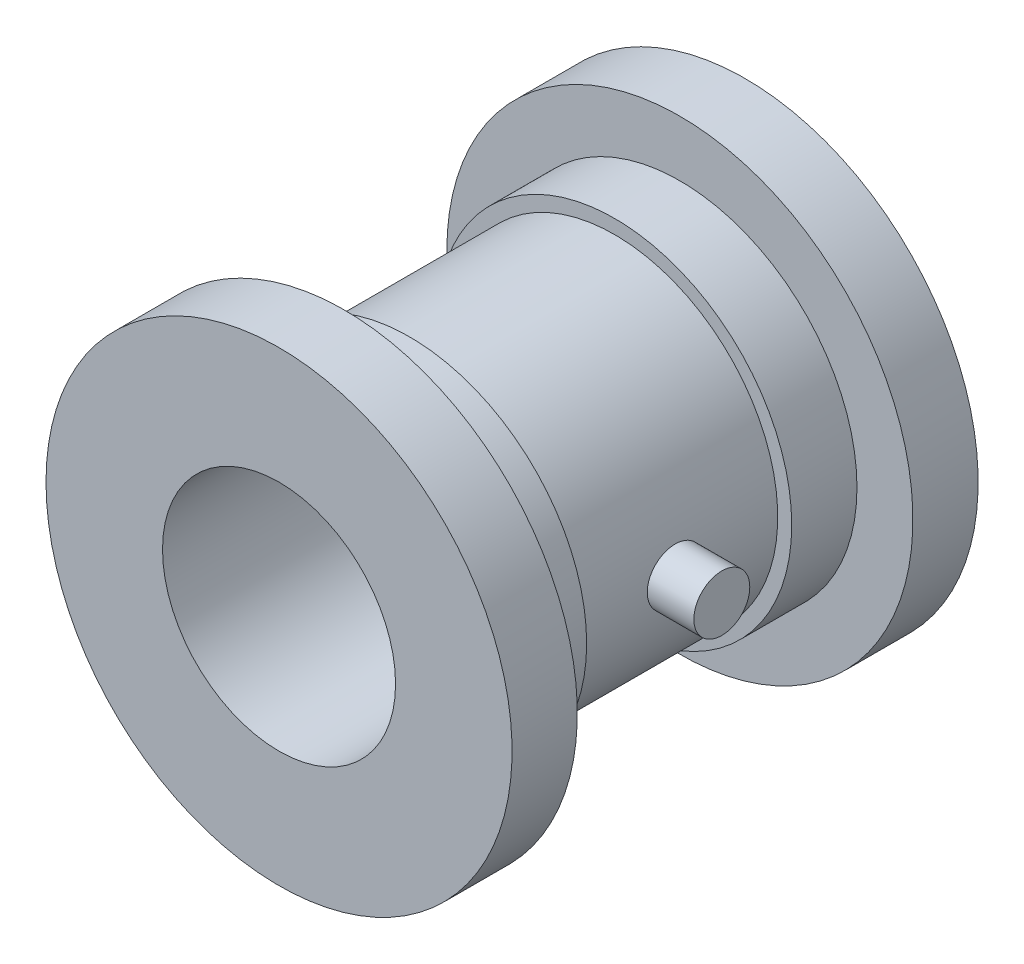
ISO-10303-21;
HEADER;
FILE_DESCRIPTION(('STEP AP214'),'2;1');
FILE_NAME('part.step','',(''),(''),'','','');
FILE_SCHEMA(('AUTOMOTIVE_DESIGN { 1 0 10303 214 1 1 1 1 }'));
ENDSEC;
DATA;
#1=APPLICATION_CONTEXT('core data for automotive mechanical design processes');
#2=APPLICATION_PROTOCOL_DEFINITION('international standard','automotive_design',2000,#1);
#3=PRODUCT_CONTEXT('',#1,'mechanical');
#4=PRODUCT('Part','Part','',(#3));
#5=PRODUCT_RELATED_PRODUCT_CATEGORY('part','',(#4));
#6=PRODUCT_DEFINITION_FORMATION('','',#4);
#7=PRODUCT_DEFINITION_CONTEXT('part definition',#1,'design');
#8=PRODUCT_DEFINITION('design','',#6,#7);
#9=PRODUCT_DEFINITION_SHAPE('','',#8);
#10=(LENGTH_UNIT() NAMED_UNIT(*) SI_UNIT(.MILLI.,.METRE.));
#11=(NAMED_UNIT(*) PLANE_ANGLE_UNIT() SI_UNIT($,.RADIAN.));
#12=(NAMED_UNIT(*) SI_UNIT($,.STERADIAN.) SOLID_ANGLE_UNIT());
#13=UNCERTAINTY_MEASURE_WITH_UNIT(LENGTH_MEASURE(1.E-05),#10,'distance_accuracy_value','');
#14=(GEOMETRIC_REPRESENTATION_CONTEXT(3) GLOBAL_UNCERTAINTY_ASSIGNED_CONTEXT((#13)) GLOBAL_UNIT_ASSIGNED_CONTEXT((#10,
#11,#12)) REPRESENTATION_CONTEXT('',''));
#15=CARTESIAN_POINT('',(0.,0.,0.));
#16=DIRECTION('',(0.,0.,1.));
#17=DIRECTION('',(1.,0.,0.));
#18=AXIS2_PLACEMENT_3D('',#15,#16,#17);
#19=CARTESIAN_POINT('',(22.5,0.,0.));
#20=DIRECTION('',(-1.,0.,0.));
#21=DIRECTION('',(0.,0.,1.));
#22=AXIS2_PLACEMENT_3D('',#19,#20,#21);
#23=CYLINDRICAL_SURFACE('',#22,3.);
#24=CARTESIAN_POINT('',(22.5,0.,0.));
#25=DIRECTION('',(1.,0.,0.));
#26=DIRECTION('',(0.,0.,-1.));
#27=AXIS2_PLACEMENT_3D('',#24,#25,#26);
#28=CIRCLE('',#27,3.);
#29=CARTESIAN_POINT('',(22.5,0.,-3.));
#30=VERTEX_POINT('',#29);
#31=EDGE_CURVE('E11',#30,#30,#28,.T.);
#32=ORIENTED_EDGE('',*,*,#31,.F.);
#33=EDGE_LOOP('',(#32));
#34=FACE_BOUND('',#33,.T.);
#35=CARTESIAN_POINT('',(17.5,0.,0.));
#36=DIRECTION('',(1.,0.,0.));
#37=DIRECTION('',(0.,0.,-1.));
#38=AXIS2_PLACEMENT_3D('',#35,#36,#37);
#39=CIRCLE('',#38,3.);
#40=CARTESIAN_POINT('',(17.5,0.,-3.));
#41=VERTEX_POINT('',#40);
#42=EDGE_CURVE('E41',#41,#41,#39,.T.);
#43=ORIENTED_EDGE('',*,*,#42,.T.);
#44=EDGE_LOOP('',(#43));
#45=FACE_BOUND('',#44,.T.);
#46=ADVANCED_FACE('F38',(#34,#45),#23,.T.);
#47=CARTESIAN_POINT('',(22.5,0.,0.));
#48=DIRECTION('',(1.,0.,0.));
#49=DIRECTION('',(0.,0.,-1.));
#50=AXIS2_PLACEMENT_3D('',#47,#48,#49);
#51=PLANE('',#50);
#52=ORIENTED_EDGE('',*,*,#31,.T.);
#53=EDGE_LOOP('',(#52));
#54=FACE_BOUND('',#53,.T.);
#55=ADVANCED_FACE('F53',(#54),#51,.T.);
#56=CARTESIAN_POINT('',(17.5,0.,0.));
#57=DIRECTION('',(1.,0.,0.));
#58=DIRECTION('',(0.,0.,-1.));
#59=AXIS2_PLACEMENT_3D('',#56,#57,#58);
#60=PLANE('',#59);
#61=ORIENTED_EDGE('',*,*,#42,.F.);
#62=EDGE_LOOP('',(#61));
#63=FACE_BOUND('',#62,.T.);
#64=ADVANCED_FACE('F51',(#63),#60,.F.);
#65=CLOSED_SHELL('',(#46,#55,#64));
#66=MANIFOLD_SOLID_BREP('B2',#65);
#67=CARTESIAN_POINT('',(0.,0.,-158.679414735268));
#68=DIRECTION('',(0.,0.,-1.));
#69=DIRECTION('',(-1.,0.,0.));
#70=AXIS2_PLACEMENT_3D('',#67,#68,#69);
#71=CYLINDRICAL_SURFACE('',#70,25.);
#72=CARTESIAN_POINT('',(0.,0.,-18.));
#73=DIRECTION('',(0.,0.,-1.));
#74=DIRECTION('',(-1.,0.,0.));
#75=AXIS2_PLACEMENT_3D('',#72,#73,#74);
#76=CIRCLE('',#75,25.);
#77=CARTESIAN_POINT('',(-25.,0.,-18.));
#78=VERTEX_POINT('',#77);
#79=EDGE_CURVE('E37',#78,#78,#76,.T.);
#80=ORIENTED_EDGE('',*,*,#79,.T.);
#81=EDGE_LOOP('',(#80));
#82=FACE_BOUND('',#81,.T.);
#83=CARTESIAN_POINT('',(0.,0.,-25.));
#84=DIRECTION('',(0.,0.,-1.));
#85=DIRECTION('',(-1.,0.,0.));
#86=AXIS2_PLACEMENT_3D('',#83,#84,#85);
#87=CIRCLE('',#86,25.);
#88=CARTESIAN_POINT('',(-25.,0.,-25.));
#89=VERTEX_POINT('',#88);
#90=EDGE_CURVE('E122',#89,#89,#87,.T.);
#91=ORIENTED_EDGE('',*,*,#90,.F.);
#92=EDGE_LOOP('',(#91));
#93=FACE_BOUND('',#92,.T.);
#94=ADVANCED_FACE('F78',(#82,#93),#71,.T.);
#95=CARTESIAN_POINT('',(0.,25.,-18.));
#96=DIRECTION('',(0.,0.,1.));
#97=DIRECTION('',(1.,0.,0.));
#98=AXIS2_PLACEMENT_3D('',#95,#96,#97);
#99=PLANE('',#98);
#100=CARTESIAN_POINT('',(0.,0.,-18.));
#101=DIRECTION('',(0.,0.,-1.));
#102=DIRECTION('',(-1.,0.,0.));
#103=AXIS2_PLACEMENT_3D('',#100,#101,#102);
#104=CIRCLE('',#103,19.);
#105=CARTESIAN_POINT('',(-19.,0.,-18.));
#106=VERTEX_POINT('',#105);
#107=EDGE_CURVE('E89',#106,#106,#104,.T.);
#108=ORIENTED_EDGE('',*,*,#107,.T.);
#109=EDGE_LOOP('',(#108));
#110=FACE_BOUND('',#109,.T.);
#111=ORIENTED_EDGE('',*,*,#79,.F.);
#112=EDGE_LOOP('',(#111));
#113=FACE_BOUND('',#112,.T.);
#114=ADVANCED_FACE('F173',(#110,#113),#99,.T.);
#115=CARTESIAN_POINT('',(0.,0.,-158.679414735268));
#116=DIRECTION('',(0.,0.,-1.));
#117=DIRECTION('',(-1.,0.,0.));
#118=AXIS2_PLACEMENT_3D('',#115,#116,#117);
#119=CYLINDRICAL_SURFACE('',#118,19.);
#120=CARTESIAN_POINT('',(0.,0.,-11.));
#121=DIRECTION('',(0.,0.,-1.));
#122=DIRECTION('',(-1.,0.,0.));
#123=AXIS2_PLACEMENT_3D('',#120,#121,#122);
#124=CIRCLE('',#123,19.);
#125=CARTESIAN_POINT('',(-19.,0.,-11.));
#126=VERTEX_POINT('',#125);
#127=EDGE_CURVE('E93',#126,#126,#124,.T.);
#128=ORIENTED_EDGE('',*,*,#127,.T.);
#129=EDGE_LOOP('',(#128));
#130=FACE_BOUND('',#129,.T.);
#131=ORIENTED_EDGE('',*,*,#107,.F.);
#132=EDGE_LOOP('',(#131));
#133=FACE_BOUND('',#132,.T.);
#134=ADVANCED_FACE('F177',(#130,#133),#119,.T.);
#135=CARTESIAN_POINT('',(0.,19.,-11.));
#136=DIRECTION('',(0.,0.,1.));
#137=DIRECTION('',(1.,0.,0.));
#138=AXIS2_PLACEMENT_3D('',#135,#136,#137);
#139=PLANE('',#138);
#140=CARTESIAN_POINT('',(0.,0.,-11.));
#141=DIRECTION('',(0.,0.,-1.));
#142=DIRECTION('',(-1.,0.,0.));
#143=AXIS2_PLACEMENT_3D('',#140,#141,#142);
#144=CIRCLE('',#143,17.5);
#145=CARTESIAN_POINT('',(-17.5,0.,-11.));
#146=VERTEX_POINT('',#145);
#147=EDGE_CURVE('E98',#146,#146,#144,.T.);
#148=ORIENTED_EDGE('',*,*,#147,.T.);
#149=EDGE_LOOP('',(#148));
#150=FACE_BOUND('',#149,.T.);
#151=ORIENTED_EDGE('',*,*,#127,.F.);
#152=EDGE_LOOP('',(#151));
#153=FACE_BOUND('',#152,.T.);
#154=ADVANCED_FACE('F169',(#150,#153),#139,.T.);
#155=CARTESIAN_POINT('',(0.,0.,-158.679414735268));
#156=DIRECTION('',(0.,0.,-1.));
#157=DIRECTION('',(-1.,0.,0.));
#158=AXIS2_PLACEMENT_3D('',#155,#156,#157);
#159=CYLINDRICAL_SURFACE('',#158,17.5);
#160=CARTESIAN_POINT('',(-17.5,0.,2.));
#161=CARTESIAN_POINT('',(-17.4999985510682,0.111949281131271,1.99999519972221));
#162=CARTESIAN_POINT('',(-17.4989143966958,0.223970370284168,1.9905688469133));
#163=CARTESIAN_POINT('',(-17.4946937577693,0.444900622583234,1.95311111433452));
#164=CARTESIAN_POINT('',(-17.4915550764498,0.553806324423903,1.92505981972606));
#165=CARTESIAN_POINT('',(-17.4835792974507,0.765274995712128,1.85118493954277));
#166=CARTESIAN_POINT('',(-17.4787432899077,0.867841986694445,1.80537275922766));
#167=CARTESIAN_POINT('',(-17.4679120331755,1.06381060236176,1.69730025928979));
#168=CARTESIAN_POINT('',(-17.4619169972561,1.15721390847253,1.63504296491735));
#169=CARTESIAN_POINT('',(-17.4494069384049,1.33265783514777,1.49553827629261));
#170=CARTESIAN_POINT('',(-17.4428898679339,1.41464987662083,1.41822996562049));
#171=CARTESIAN_POINT('',(-17.4300869526196,1.56452579579969,1.25094824366483));
#172=CARTESIAN_POINT('',(-17.4238011190613,1.63240898570475,1.16097421529119));
#173=CARTESIAN_POINT('',(-17.4121519566138,1.75231750467917,0.97060423254096));
#174=CARTESIAN_POINT('',(-17.4067912557056,1.80429797266076,0.870179846835984));
#175=CARTESIAN_POINT('',(-17.3976257108765,1.89063905410776,0.661956037568454));
#176=CARTESIAN_POINT('',(-17.3938208173886,1.92500022892039,0.554156849089708));
#177=CARTESIAN_POINT('',(-17.3882168566911,1.97498120601605,0.334744186795484));
#178=CARTESIAN_POINT('',(-17.3864090748178,1.99068245631194,0.223149492773667));
#179=CARTESIAN_POINT('',(-17.3849772070577,2.00314979639016,-0.00110459341705646));
#180=CARTESIAN_POINT('',(-17.3853530472536,1.99991652712141,-0.1137639494174));
#181=CARTESIAN_POINT('',(-17.3882379876878,1.9746735877826,-0.336384576951136));
#182=CARTESIAN_POINT('',(-17.3907369355841,1.95275327430006,-0.446356130792127));
#183=CARTESIAN_POINT('',(-17.3975706833085,1.89089772862114,-0.661049381098405));
#184=CARTESIAN_POINT('',(-17.4019055147219,1.85096218648165,-0.765770987206492));
#185=CARTESIAN_POINT('',(-17.4119342022004,1.75411258690629,-0.967271409063269));
#186=CARTESIAN_POINT('',(-17.4176311898807,1.697159329054,-1.0640312212313));
#187=CARTESIAN_POINT('',(-17.4297397716759,1.5679190891396,-1.24665329274372));
#188=CARTESIAN_POINT('',(-17.4361513931222,1.49563152051157,-1.33251513501963));
#189=CARTESIAN_POINT('',(-17.4490120091816,1.33727766100704,-1.49142289169273));
#190=CARTESIAN_POINT('',(-17.455461005996,1.25113428048549,-1.56439200697674));
#191=CARTESIAN_POINT('',(-17.4676349914203,1.06778054344645,-1.69484625362185));
#192=CARTESIAN_POINT('',(-17.4733599787928,0.970570168013122,-1.75233135851693));
#193=CARTESIAN_POINT('',(-17.4834436495983,0.767785399909199,-1.85018441798749));
#194=CARTESIAN_POINT('',(-17.487801982302,0.662208868897606,-1.89054797953882));
#195=CARTESIAN_POINT('',(-17.4946579437091,0.445716005555924,-1.95295335032392));
#196=CARTESIAN_POINT('',(-17.4971556451608,0.33479988217787,-1.97499587589154));
#197=CARTESIAN_POINT('',(-17.4999995196358,0.111440847189143,-2.00003489194185));
#198=CARTESIAN_POINT('',(-17.5003576527763,-0.000990049263884221,-2.00313725942906));
#199=CARTESIAN_POINT('',(-17.4989142301576,-0.224770143214528,-1.99048670077362));
#200=CARTESIAN_POINT('',(-17.4971127126976,-0.336119359859263,-1.97473410900327));
#201=CARTESIAN_POINT('',(-17.4915599395696,-0.554265994438542,-1.9249086964044));
#202=CARTESIAN_POINT('',(-17.4878140135584,-0.661074995715398,-1.89088594563397));
#203=CARTESIAN_POINT('',(-17.4787921749894,-0.86747060654654,-1.80553777762337));
#204=CARTESIAN_POINT('',(-17.4735162183709,-0.967057008006426,-1.75421186209241));
#205=CARTESIAN_POINT('',(-17.4619935546906,-1.1566560556988,-1.63545523933527));
#206=CARTESIAN_POINT('',(-17.4557427309721,-1.24662524248109,-1.56795555368873));
#207=CARTESIAN_POINT('',(-17.4429836190554,-1.41399482686995,-1.41886564059422));
#208=CARTESIAN_POINT('',(-17.4364753223705,-1.49139480973755,-1.33727494837641));
#209=CARTESIAN_POINT('',(-17.4238982965486,-1.63180089287333,-1.16185467559832));
#210=CARTESIAN_POINT('',(-17.4178317940395,-1.69473712215655,-1.06796898786935));
#211=CARTESIAN_POINT('',(-17.4068606742744,-1.80394755942105,-0.87089807794968));
#212=CARTESIAN_POINT('',(-17.4019560370195,-1.85022205420212,-0.767713015868109));
#213=CARTESIAN_POINT('',(-17.3938786287494,-1.92468057699606,-0.555204287235232));
#214=CARTESIAN_POINT('',(-17.3907019940762,-1.9529049884149,-0.445894923210457));
#215=CARTESIAN_POINT('',(-17.3864287991637,-1.99059267414119,-0.224049989074731));
#216=CARTESIAN_POINT('',(-17.385332159207,-2.00005666745658,-0.111514542773653));
#217=CARTESIAN_POINT('',(-17.385345163739,-1.99994314687055,0.112893307638868));
#218=CARTESIAN_POINT('',(-17.3864420908835,-1.99047539100516,0.224765784023058));
#219=CARTESIAN_POINT('',(-17.3906913968281,-1.95299850876729,0.445318988088051));
#220=CARTESIAN_POINT('',(-17.3938437768924,-1.92498937098975,0.553999713805521));
#221=CARTESIAN_POINT('',(-17.4018450488478,-1.85125733006852,0.765076043362251));
#222=CARTESIAN_POINT('',(-17.4066935227579,-1.80553879088569,0.867473188409541));
#223=CARTESIAN_POINT('',(-17.4175414489812,-1.69769666392679,1.06315918160624));
#224=CARTESIAN_POINT('',(-17.4235409062907,-1.63557300493567,1.15644799021371));
#225=CARTESIAN_POINT('',(-17.4360565183282,-1.496274276119,1.33183113362611));
#226=CARTESIAN_POINT('',(-17.4425753637158,-1.41901733601474,1.41386025390555));
#227=CARTESIAN_POINT('',(-17.4553710614581,-1.25181311513089,1.56383427394015));
#228=CARTESIAN_POINT('',(-17.4616478560018,-1.16186282631113,1.63177582580489));
#229=CARTESIAN_POINT('',(-17.4732739611811,-0.971500170550116,1.75182617233102));
#230=CARTESIAN_POINT('',(-17.4786202345149,-0.871055194164788,1.80388352106762));
#231=CARTESIAN_POINT('',(-17.4877513427388,-0.662847939396797,1.8903202121152));
#232=CARTESIAN_POINT('',(-17.4915379025678,-0.555093898848711,1.92471909393972));
#233=CARTESIAN_POINT('',(-17.4961924479184,-0.372298085692646,1.96647110226512));
#234=CARTESIAN_POINT('',(-17.4976134605341,-0.298416630910324,1.97902677875614));
#235=CARTESIAN_POINT('',(-17.499517718344,-0.149700818660187,1.99579280851968));
#236=CARTESIAN_POINT('',(-17.5000009689781,-0.074866466722564,2.00000321020228));
#237=CARTESIAN_POINT('',(-17.5,0.,2.));
#238=B_SPLINE_CURVE_WITH_KNOTS('',3,(#160,#161,#162,#163,#164,#165,#166,#167,#168,#169,#170,
#171,#172,#173,#174,#175,#176,#177,#178,#179,#180,#181,#182,#183,#184,#185,#186,#187,#188,#189,
#190,#191,#192,#193,#194,#195,#196,#197,#198,#199,#200,#201,#202,#203,#204,#205,#206,#207,#208,
#209,#210,#211,#212,#213,#214,#215,#216,#217,#218,#219,#220,#221,#222,#223,#224,#225,#226,#227,
#228,#229,#230,#231,#232,#233,#234,#235,#236,#237),.UNSPECIFIED.,.T.,.F.,(4,2,2,2,2,2,2,2,2,2,2,
2,2,2,2,2,2,2,2,2,2,2,2,2,2,2,2,2,2,2,2,2,2,2,2,2,2,2,4),(0.,0.33557441666428,0.671508227518322,
1.00722667281621,1.34288340216198,1.67992799894876,2.01698902267013,2.3549922992977,
2.69298480653802,3.02949654002249,3.36599688237659,3.70089713523239,4.03580315010126,
4.3714866496878,4.7071829921089,5.04481612297898,5.38244983094421,5.72017011621975,
6.05787719635448,6.39369472529332,6.72950629895979,7.06440223033913,7.3993078067643,
7.73566795085562,8.07203919137998,8.41000271890796,8.74796042876379,9.08515935679785,
9.42234536116483,9.75758217571838,10.0928191964808,10.4279736604432,10.763129579344,
11.100151413458,11.4372532487619,11.7754355791756,12.1132428917892,12.3376607387197,
12.5620772838218),.UNSPECIFIED.);
#239=CARTESIAN_POINT('',(-17.5,0.,2.));
#240=VERTEX_POINT('',#239);
#241=EDGE_CURVE('E125',#240,#240,#238,.T.);
#242=ORIENTED_EDGE('',*,*,#241,.F.);
#243=EDGE_LOOP('',(#242));
#244=FACE_BOUND('',#243,.T.);
#245=CARTESIAN_POINT('',(0.,0.,11.));
#246=DIRECTION('',(0.,0.,-1.));
#247=DIRECTION('',(-1.,0.,0.));
#248=AXIS2_PLACEMENT_3D('',#245,#246,#247);
#249=CIRCLE('',#248,17.5);
#250=CARTESIAN_POINT('',(-17.5,0.,11.));
#251=VERTEX_POINT('',#250);
#252=EDGE_CURVE('E101',#251,#251,#249,.T.);
#253=ORIENTED_EDGE('',*,*,#252,.T.);
#254=EDGE_LOOP('',(#253));
#255=FACE_BOUND('',#254,.T.);
#256=ORIENTED_EDGE('',*,*,#147,.F.);
#257=EDGE_LOOP('',(#256));
#258=FACE_BOUND('',#257,.T.);
#259=ADVANCED_FACE('F130',(#244,#255,#258),#159,.T.);
#260=CARTESIAN_POINT('',(0.,19.,11.));
#261=DIRECTION('',(0.,0.,-1.));
#262=DIRECTION('',(-1.,0.,0.));
#263=AXIS2_PLACEMENT_3D('',#260,#261,#262);
#264=PLANE('',#263);
#265=CARTESIAN_POINT('',(0.,0.,11.));
#266=DIRECTION('',(0.,0.,-1.));
#267=DIRECTION('',(-1.,0.,0.));
#268=AXIS2_PLACEMENT_3D('',#265,#266,#267);
#269=CIRCLE('',#268,19.);
#270=CARTESIAN_POINT('',(-19.,0.,11.));
#271=VERTEX_POINT('',#270);
#272=EDGE_CURVE('E104',#271,#271,#269,.T.);
#273=ORIENTED_EDGE('',*,*,#272,.T.);
#274=EDGE_LOOP('',(#273));
#275=FACE_BOUND('',#274,.T.);
#276=ORIENTED_EDGE('',*,*,#252,.F.);
#277=EDGE_LOOP('',(#276));
#278=FACE_BOUND('',#277,.T.);
#279=ADVANCED_FACE('F162',(#275,#278),#264,.T.);
#280=CARTESIAN_POINT('',(0.,0.,-158.679414735268));
#281=DIRECTION('',(0.,0.,-1.));
#282=DIRECTION('',(-1.,0.,0.));
#283=AXIS2_PLACEMENT_3D('',#280,#281,#282);
#284=CYLINDRICAL_SURFACE('',#283,19.);
#285=CARTESIAN_POINT('',(0.,0.,18.));
#286=DIRECTION('',(0.,0.,-1.));
#287=DIRECTION('',(-1.,0.,0.));
#288=AXIS2_PLACEMENT_3D('',#285,#286,#287);
#289=CIRCLE('',#288,19.);
#290=CARTESIAN_POINT('',(-19.,0.,18.));
#291=VERTEX_POINT('',#290);
#292=EDGE_CURVE('E107',#291,#291,#289,.T.);
#293=ORIENTED_EDGE('',*,*,#292,.T.);
#294=EDGE_LOOP('',(#293));
#295=FACE_BOUND('',#294,.T.);
#296=ORIENTED_EDGE('',*,*,#272,.F.);
#297=EDGE_LOOP('',(#296));
#298=FACE_BOUND('',#297,.T.);
#299=ADVANCED_FACE('F159',(#295,#298),#284,.T.);
#300=CARTESIAN_POINT('',(0.,25.,18.));
#301=DIRECTION('',(0.,0.,-1.));
#302=DIRECTION('',(-1.,0.,0.));
#303=AXIS2_PLACEMENT_3D('',#300,#301,#302);
#304=PLANE('',#303);
#305=CARTESIAN_POINT('',(0.,0.,18.));
#306=DIRECTION('',(0.,0.,-1.));
#307=DIRECTION('',(-1.,0.,0.));
#308=AXIS2_PLACEMENT_3D('',#305,#306,#307);
#309=CIRCLE('',#308,25.);
#310=CARTESIAN_POINT('',(-25.,0.,18.));
#311=VERTEX_POINT('',#310);
#312=EDGE_CURVE('E110',#311,#311,#309,.T.);
#313=ORIENTED_EDGE('',*,*,#312,.T.);
#314=EDGE_LOOP('',(#313));
#315=FACE_BOUND('',#314,.T.);
#316=ORIENTED_EDGE('',*,*,#292,.F.);
#317=EDGE_LOOP('',(#316));
#318=FACE_BOUND('',#317,.T.);
#319=ADVANCED_FACE('F155',(#315,#318),#304,.T.);
#320=CARTESIAN_POINT('',(0.,0.,-158.679414735268));
#321=DIRECTION('',(0.,0.,-1.));
#322=DIRECTION('',(-1.,0.,0.));
#323=AXIS2_PLACEMENT_3D('',#320,#321,#322);
#324=CYLINDRICAL_SURFACE('',#323,25.);
#325=CARTESIAN_POINT('',(0.,0.,25.));
#326=DIRECTION('',(0.,0.,-1.));
#327=DIRECTION('',(-1.,0.,0.));
#328=AXIS2_PLACEMENT_3D('',#325,#326,#327);
#329=CIRCLE('',#328,25.);
#330=CARTESIAN_POINT('',(-25.,0.,25.));
#331=VERTEX_POINT('',#330);
#332=EDGE_CURVE('E113',#331,#331,#329,.T.);
#333=ORIENTED_EDGE('',*,*,#332,.T.);
#334=EDGE_LOOP('',(#333));
#335=FACE_BOUND('',#334,.T.);
#336=ORIENTED_EDGE('',*,*,#312,.F.);
#337=EDGE_LOOP('',(#336));
#338=FACE_BOUND('',#337,.T.);
#339=ADVANCED_FACE('F151',(#335,#338),#324,.T.);
#340=CARTESIAN_POINT('',(0.,12.5,25.));
#341=DIRECTION('',(0.,0.,1.));
#342=DIRECTION('',(1.,0.,0.));
#343=AXIS2_PLACEMENT_3D('',#340,#341,#342);
#344=PLANE('',#343);
#345=CARTESIAN_POINT('',(0.,0.,25.));
#346=DIRECTION('',(0.,0.,-1.));
#347=DIRECTION('',(-1.,0.,0.));
#348=AXIS2_PLACEMENT_3D('',#345,#346,#347);
#349=CIRCLE('',#348,12.5);
#350=CARTESIAN_POINT('',(-12.5,0.,25.));
#351=VERTEX_POINT('',#350);
#352=EDGE_CURVE('E116',#351,#351,#349,.T.);
#353=ORIENTED_EDGE('',*,*,#352,.T.);
#354=EDGE_LOOP('',(#353));
#355=FACE_BOUND('',#354,.T.);
#356=ORIENTED_EDGE('',*,*,#332,.F.);
#357=EDGE_LOOP('',(#356));
#358=FACE_BOUND('',#357,.T.);
#359=ADVANCED_FACE('F147',(#355,#358),#344,.T.);
#360=CARTESIAN_POINT('',(0.,0.,-158.679414735268));
#361=DIRECTION('',(0.,0.,-1.));
#362=DIRECTION('',(-1.,0.,0.));
#363=AXIS2_PLACEMENT_3D('',#360,#361,#362);
#364=CYLINDRICAL_SURFACE('',#363,12.5);
#365=CARTESIAN_POINT('',(-12.5,0.,2.));
#366=CARTESIAN_POINT('',(-12.4999981342099,-0.111577020127934,1.99999547136982));
#367=CARTESIAN_POINT('',(-12.4984904676373,-0.223216523860334,1.99063139270684));
#368=CARTESIAN_POINT('',(-12.4926212341856,-0.443368779658238,1.95343555230202));
#369=CARTESIAN_POINT('',(-12.4882569793104,-0.551878486135174,1.92558639609986));
#370=CARTESIAN_POINT('',(-12.4771644640129,-0.762553771126289,1.85227911955399));
#371=CARTESIAN_POINT('',(-12.4704380773984,-0.864724302944007,1.80683495387921));
#372=CARTESIAN_POINT('',(-12.4553623980115,-1.05997584434546,1.69966320560222));
#373=CARTESIAN_POINT('',(-12.4470133072085,-1.15305798294893,1.63793764911637));
#374=CARTESIAN_POINT('',(-12.4295364290338,-1.32832749604674,1.49937439573757));
#375=CARTESIAN_POINT('',(-12.4204030044304,-1.41042286652597,1.42242102105483));
#376=CARTESIAN_POINT('',(-12.4024303990938,-1.56059410283783,1.25583553272503));
#377=CARTESIAN_POINT('',(-12.393591236265,-1.62866911690709,1.16620264933132));
#378=CARTESIAN_POINT('',(-12.377153335782,-1.74923165413214,0.97617611384793));
#379=CARTESIAN_POINT('',(-12.369561883485,-1.80162899846097,0.875724562638395));
#380=CARTESIAN_POINT('',(-12.3565566594955,-1.88877230962607,0.667304337131193));
#381=CARTESIAN_POINT('',(-12.3511427525034,-1.92351937318009,0.559336130362525));
#382=CARTESIAN_POINT('',(-12.3431614474236,-1.97408758681328,0.339919623135182));
#383=CARTESIAN_POINT('',(-12.3405702530036,-1.990067044504,0.228508689049974));
#384=CARTESIAN_POINT('',(-12.3384556715911,-2.00313711337577,0.00455901291455965));
#385=CARTESIAN_POINT('',(-12.3389320844424,-2.00022895694192,-0.107979655074505));
#386=CARTESIAN_POINT('',(-12.3428771480604,-1.97573547058135,-0.329865030498936));
#387=CARTESIAN_POINT('',(-12.3463174079177,-1.95432734726414,-0.43923187736104));
#388=CARTESIAN_POINT('',(-12.3557581320174,-1.8937194351384,-0.652801071097961));
#389=CARTESIAN_POINT('',(-12.36175867776,-1.85451907995672,-0.757003253450901));
#390=CARTESIAN_POINT('',(-12.375674818266,-1.75925788747207,-0.957819267855852));
#391=CARTESIAN_POINT('',(-12.3835988093069,-1.70312285817509,-1.05439729968538));
#392=CARTESIAN_POINT('',(-12.4004630811492,-1.57563852632363,-1.23683027168534));
#393=CARTESIAN_POINT('',(-12.4094034376511,-1.50428809015537,-1.32268441212319));
#394=CARTESIAN_POINT('',(-12.4274181245254,-1.34742984087892,-1.48225880043735));
#395=CARTESIAN_POINT('',(-12.4364928200271,-1.26176985545599,-1.55582950706879));
#396=CARTESIAN_POINT('',(-12.4536592708467,-1.07924037468052,-1.68757473884301));
#397=CARTESIAN_POINT('',(-12.4617510207175,-0.982370817216379,-1.74574917867007));
#398=CARTESIAN_POINT('',(-12.4760500569944,-0.780035888309119,-1.84506167811398));
#399=CARTESIAN_POINT('',(-12.4822559575706,-0.674564267421531,-1.88618721726887));
#400=CARTESIAN_POINT('',(-12.492072755936,-0.45808983393977,-1.95009935792601));
#401=CARTESIAN_POINT('',(-12.4956838535962,-0.347087448070729,-1.97288737193707));
#402=CARTESIAN_POINT('',(-12.4998774645506,-0.123992055401969,-1.99927647001296));
#403=CARTESIAN_POINT('',(-12.5004923996757,-0.0119239336604368,-2.00308296595766));
#404=CARTESIAN_POINT('',(-12.4987129750933,0.211249371511144,-1.99194761839074));
#405=CARTESIAN_POINT('',(-12.4963187218055,0.322354588854289,-1.97700643788865));
#406=CARTESIAN_POINT('',(-12.4888100015234,0.539818798235509,-1.92897070181076));
#407=CARTESIAN_POINT('',(-12.4837106780256,0.646200674402083,-1.89597717469545));
#408=CARTESIAN_POINT('',(-12.4713614614776,0.851922990585996,-1.81288053146995));
#409=CARTESIAN_POINT('',(-12.4641114556453,0.951263060991193,-1.7627765180619));
#410=CARTESIAN_POINT('',(-12.4481852151843,1.14097865112887,-1.64640600069669));
#411=CARTESIAN_POINT('',(-12.4394977755831,1.2312740030957,-1.58001036397693));
#412=CARTESIAN_POINT('',(-12.4216959541371,1.39951415639529,-1.43311984563749));
#413=CARTESIAN_POINT('',(-12.4125815438834,1.47745813440283,-1.35262402487174));
#414=CARTESIAN_POINT('',(-12.3948490273073,1.61953866530001,-1.17889961189604));
#415=CARTESIAN_POINT('',(-12.3862364645378,1.6835368741472,-1.08555722121318));
#416=CARTESIAN_POINT('',(-12.3705841030174,1.7949448921012,-0.889326218879665));
#417=CARTESIAN_POINT('',(-12.3635442573346,1.84235519623835,-0.786437892222901));
#418=CARTESIAN_POINT('',(-12.3518754120478,1.91903158354154,-0.574433040781785));
#419=CARTESIAN_POINT('',(-12.3472370587722,1.94836814902516,-0.465342545402131));
#420=CARTESIAN_POINT('',(-12.3408723222072,1.9882871855446,-0.243702430007985));
#421=CARTESIAN_POINT('',(-12.3391457074239,1.99887114748454,-0.13115308570916));
#422=CARTESIAN_POINT('',(-12.3388093758569,2.00094546618394,0.0928294934366215));
#423=CARTESIAN_POINT('',(-12.3401641282165,1.99265347821446,0.204260719539763));
#424=CARTESIAN_POINT('',(-12.3457602825821,1.95768017972975,0.424121322627228));
#425=CARTESIAN_POINT('',(-12.3500016772787,1.93099891577862,0.532550707211893));
#426=CARTESIAN_POINT('',(-12.3608801586201,1.86008521855063,0.743255350016468));
#427=CARTESIAN_POINT('',(-12.3675148843103,1.81587007770133,0.845536557641318));
#428=CARTESIAN_POINT('',(-12.3824349767408,1.71116577284244,1.04126446767307));
#429=CARTESIAN_POINT('',(-12.3907204147391,1.65067590624507,1.13471078843823));
#430=CARTESIAN_POINT('',(-12.4081216807701,1.51435663599677,1.31121858083654));
#431=CARTESIAN_POINT('',(-12.417245602178,1.43836664580959,1.39415524790042));
#432=CARTESIAN_POINT('',(-12.4352300129975,1.27354334357953,1.54617538139752));
#433=CARTESIAN_POINT('',(-12.44409044097,1.18470706402004,1.61525563814871));
#434=CARTESIAN_POINT('',(-12.4606140562915,0.996048346577333,1.73799746617181));
#435=CARTESIAN_POINT('',(-12.4682693265296,0.896160049794846,1.7915588738874));
#436=CARTESIAN_POINT('',(-12.4814428750468,0.688725166968655,1.88106129289908));
#437=CARTESIAN_POINT('',(-12.4869633156233,0.581186461209753,1.91702014310397));
#438=CARTESIAN_POINT('',(-12.4940175589639,0.394335518838039,1.96234573873548));
#439=CARTESIAN_POINT('',(-12.4962491778317,0.316163477498691,1.9764439027928));
#440=CARTESIAN_POINT('',(-12.4992410506714,0.158671480151703,1.99527257286361));
#441=CARTESIAN_POINT('',(-12.5000013269159,0.079351541538827,2.00000322067918));
#442=CARTESIAN_POINT('',(-12.5,0.,2.));
#443=B_SPLINE_CURVE_WITH_KNOTS('',3,(#365,#366,#367,#368,#369,#370,#371,#372,#373,#374,#375,
#376,#377,#378,#379,#380,#381,#382,#383,#384,#385,#386,#387,#388,#389,#390,#391,#392,#393,#394,
#395,#396,#397,#398,#399,#400,#401,#402,#403,#404,#405,#406,#407,#408,#409,#410,#411,#412,#413,
#414,#415,#416,#417,#418,#419,#420,#421,#422,#423,#424,#425,#426,#427,#428,#429,#430,#431,#432,
#433,#434,#435,#436,#437,#438,#439,#440,#441,#442),.UNSPECIFIED.,.T.,.F.,(4,2,2,2,2,2,2,2,2,2,2,
2,2,2,2,2,2,2,2,2,2,2,2,2,2,2,2,2,2,2,2,2,2,2,2,2,2,2,4),(0.,0.334441046622945,
0.669197249319467,1.00368849765685,1.33813814029104,1.67523334608234,2.0123490250128,
2.35136809625945,2.69036609964137,3.0264835846965,3.36257913887026,3.695490558905,
4.02841257712192,4.36281487068318,4.69724208737484,5.0354831333739,5.37372605363721,
5.71221693636019,6.05068174320194,6.38547572150114,6.72025786018134,7.05318530227048,
7.38613020622256,7.72180459283845,8.0575013456327,8.39639027086604,8.73526908182521,
9.07281785760314,9.41033979575026,9.74398956846142,10.0776384963298,10.4109591848676,
10.7442942653298,11.0812763085405,11.4183363199473,11.7575256865024,12.0963705940352,
12.3342225666999,12.5720709388195),.UNSPECIFIED.);
#444=CARTESIAN_POINT('',(-12.5,0.,2.));
#445=VERTEX_POINT('',#444);
#446=EDGE_CURVE('E81',#445,#445,#443,.T.);
#447=ORIENTED_EDGE('',*,*,#446,.F.);
#448=EDGE_LOOP('',(#447));
#449=FACE_BOUND('',#448,.T.);
#450=CARTESIAN_POINT('',(0.,0.,-25.));
#451=DIRECTION('',(0.,0.,-1.));
#452=DIRECTION('',(-1.,0.,0.));
#453=AXIS2_PLACEMENT_3D('',#450,#451,#452);
#454=CIRCLE('',#453,12.5);
#455=CARTESIAN_POINT('',(-12.5,0.,-25.));
#456=VERTEX_POINT('',#455);
#457=EDGE_CURVE('E119',#456,#456,#454,.T.);
#458=ORIENTED_EDGE('',*,*,#457,.T.);
#459=EDGE_LOOP('',(#458));
#460=FACE_BOUND('',#459,.T.);
#461=ORIENTED_EDGE('',*,*,#352,.F.);
#462=EDGE_LOOP('',(#461));
#463=FACE_BOUND('',#462,.T.);
#464=ADVANCED_FACE('F142',(#449,#460,#463),#364,.F.);
#465=CARTESIAN_POINT('',(0.,12.5,-25.));
#466=DIRECTION('',(0.,0.,-1.));
#467=DIRECTION('',(-1.,0.,0.));
#468=AXIS2_PLACEMENT_3D('',#465,#466,#467);
#469=PLANE('',#468);
#470=ORIENTED_EDGE('',*,*,#90,.T.);
#471=EDGE_LOOP('',(#470));
#472=FACE_BOUND('',#471,.T.);
#473=ORIENTED_EDGE('',*,*,#457,.F.);
#474=EDGE_LOOP('',(#473));
#475=FACE_BOUND('',#474,.T.);
#476=ADVANCED_FACE('F138',(#472,#475),#469,.T.);
#477=CARTESIAN_POINT('',(-78.,0.,0.));
#478=DIRECTION('',(1.,0.,0.));
#479=DIRECTION('',(0.,0.,-1.));
#480=AXIS2_PLACEMENT_3D('',#477,#478,#479);
#481=CYLINDRICAL_SURFACE('',#480,2.);
#482=ORIENTED_EDGE('',*,*,#241,.T.);
#483=EDGE_LOOP('',(#482));
#484=FACE_BOUND('',#483,.T.);
#485=ORIENTED_EDGE('',*,*,#446,.T.);
#486=EDGE_LOOP('',(#485));
#487=FACE_BOUND('',#486,.T.);
#488=ADVANCED_FACE('F134',(#484,#487),#481,.F.);
#489=CLOSED_SHELL('',(#94,#114,#134,#154,#259,#279,#299,#319,#339,#359,#464,#476,#488));
#490=MANIFOLD_SOLID_BREP('B6',#489);
#491=ADVANCED_BREP_SHAPE_REPRESENTATION('',(#18,#66,#490),#14);
#492=SHAPE_DEFINITION_REPRESENTATION(#9,#491);
ENDSEC;
END-ISO-10303-21;
